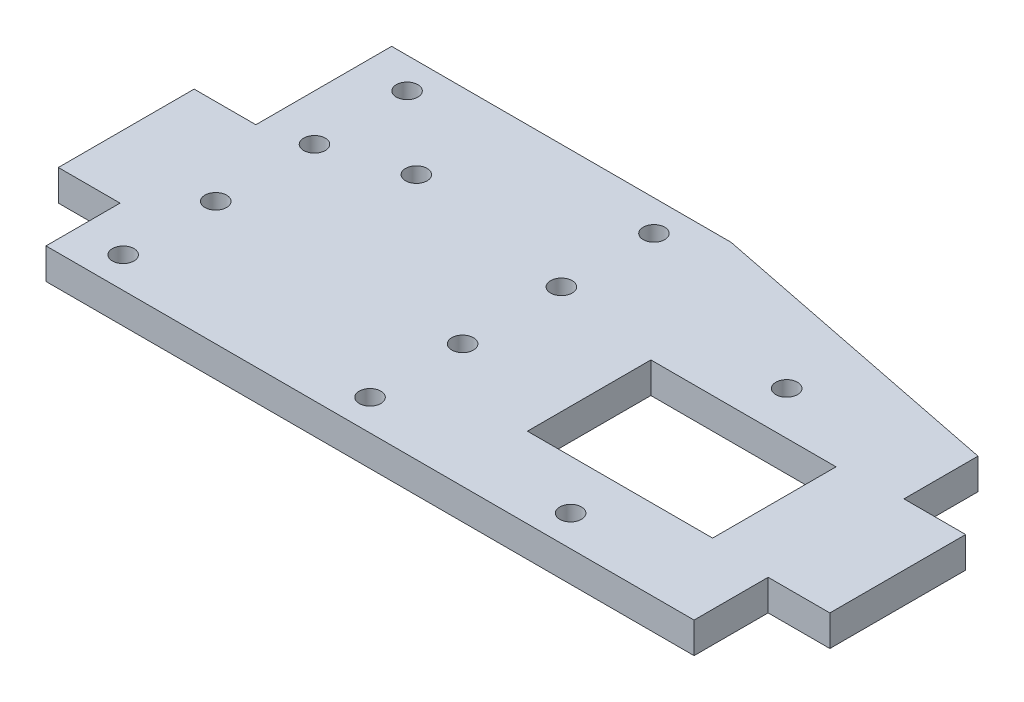
ISO-10303-21;
HEADER;
FILE_DESCRIPTION(('STEP AP214'),'2;1');
FILE_NAME('part.step','',(''),(''),'','','');
FILE_SCHEMA(('AUTOMOTIVE_DESIGN { 1 0 10303 214 1 1 1 1 }'));
ENDSEC;
DATA;
#1=APPLICATION_CONTEXT('core data for automotive mechanical design processes');
#2=APPLICATION_PROTOCOL_DEFINITION('international standard','automotive_design',2000,#1);
#3=PRODUCT_CONTEXT('',#1,'mechanical');
#4=PRODUCT('Part','Part','',(#3));
#5=PRODUCT_RELATED_PRODUCT_CATEGORY('part','',(#4));
#6=PRODUCT_DEFINITION_FORMATION('','',#4);
#7=PRODUCT_DEFINITION_CONTEXT('part definition',#1,'design');
#8=PRODUCT_DEFINITION('design','',#6,#7);
#9=PRODUCT_DEFINITION_SHAPE('','',#8);
#10=(LENGTH_UNIT() NAMED_UNIT(*) SI_UNIT(.MILLI.,.METRE.));
#11=(NAMED_UNIT(*) PLANE_ANGLE_UNIT() SI_UNIT($,.RADIAN.));
#12=(NAMED_UNIT(*) SI_UNIT($,.STERADIAN.) SOLID_ANGLE_UNIT());
#13=UNCERTAINTY_MEASURE_WITH_UNIT(LENGTH_MEASURE(1.E-05),#10,'distance_accuracy_value','');
#14=(GEOMETRIC_REPRESENTATION_CONTEXT(3) GLOBAL_UNCERTAINTY_ASSIGNED_CONTEXT((#13)) GLOBAL_UNIT_ASSIGNED_CONTEXT((#10,
#11,#12)) REPRESENTATION_CONTEXT('',''));
#15=CARTESIAN_POINT('',(0.,0.,0.));
#16=DIRECTION('',(0.,0.,1.));
#17=DIRECTION('',(1.,0.,0.));
#18=AXIS2_PLACEMENT_3D('',#15,#16,#17);
#19=CARTESIAN_POINT('',(-27.5,5.,-28.));
#20=DIRECTION('',(1.,0.,0.));
#21=DIRECTION('',(0.,0.,-1.));
#22=AXIS2_PLACEMENT_3D('',#19,#20,#21);
#23=PLANE('',#22);
#24=DIRECTION('',(0.,1.,0.));
#25=VECTOR('',#24,1.);
#26=CARTESIAN_POINT('',(-27.5,0.,16.));
#27=LINE('',#26,#25);
#28=CARTESIAN_POINT('',(-27.5,0.,16.));
#29=VERTEX_POINT('',#28);
#30=CARTESIAN_POINT('',(-27.5,5.,16.));
#31=VERTEX_POINT('',#30);
#32=EDGE_CURVE('E309',#29,#31,#27,.T.);
#33=ORIENTED_EDGE('',*,*,#32,.F.);
#34=DIRECTION('',(0.,0.,1.));
#35=VECTOR('',#34,1.);
#36=CARTESIAN_POINT('',(-27.5,0.,-28.));
#37=LINE('',#36,#35);
#38=CARTESIAN_POINT('',(-27.5,0.,28.));
#39=VERTEX_POINT('',#38);
#40=EDGE_CURVE('E80',#29,#39,#37,.T.);
#41=ORIENTED_EDGE('',*,*,#40,.T.);
#42=DIRECTION('',(0.,-1.,0.));
#43=VECTOR('',#42,1.);
#44=CARTESIAN_POINT('',(-27.5,5.,28.));
#45=LINE('',#44,#43);
#46=CARTESIAN_POINT('',(-27.5,5.,28.));
#47=VERTEX_POINT('',#46);
#48=EDGE_CURVE('E196',#47,#39,#45,.T.);
#49=ORIENTED_EDGE('',*,*,#48,.F.);
#50=DIRECTION('',(0.,0.,1.));
#51=VECTOR('',#50,1.);
#52=CARTESIAN_POINT('',(-27.5,5.,-28.));
#53=LINE('',#52,#51);
#54=EDGE_CURVE('E62',#31,#47,#53,.T.);
#55=ORIENTED_EDGE('',*,*,#54,.F.);
#56=EDGE_LOOP('',(#33,#41,#49,#55));
#57=FACE_BOUND('',#56,.T.);
#58=ADVANCED_FACE('F38',(#57),#23,.F.);
#59=CARTESIAN_POINT('',(0.,5.,0.));
#60=DIRECTION('',(0.,1.,0.));
#61=DIRECTION('',(0.,0.,1.));
#62=AXIS2_PLACEMENT_3D('',#59,#60,#61);
#63=PLANE('',#62);
#64=CARTESIAN_POINT('',(-7.5,5.,-12.));
#65=DIRECTION('',(0.,1.,0.));
#66=DIRECTION('',(0.,0.,1.));
#67=AXIS2_PLACEMENT_3D('',#64,#65,#66);
#68=CIRCLE('',#67,1.75);
#69=CARTESIAN_POINT('',(-7.5,5.,-10.25));
#70=VERTEX_POINT('',#69);
#71=EDGE_CURVE('E354',#70,#70,#68,.T.);
#72=ORIENTED_EDGE('',*,*,#71,.F.);
#73=EDGE_LOOP('',(#72));
#74=FACE_BOUND('',#73,.T.);
#75=CARTESIAN_POINT('',(52.5,5.,-12.));
#76=DIRECTION('',(0.,1.,0.));
#77=DIRECTION('',(0.,0.,1.));
#78=AXIS2_PLACEMENT_3D('',#75,#76,#77);
#79=CIRCLE('',#78,1.75);
#80=CARTESIAN_POINT('',(52.5,5.,-10.25));
#81=VERTEX_POINT('',#80);
#82=EDGE_CURVE('E348',#81,#81,#79,.T.);
#83=ORIENTED_EDGE('',*,*,#82,.F.);
#84=EDGE_LOOP('',(#83));
#85=FACE_BOUND('',#84,.T.);
#86=CARTESIAN_POINT('',(52.5,5.,23.));
#87=DIRECTION('',(0.,1.,0.));
#88=DIRECTION('',(0.,0.,1.));
#89=AXIS2_PLACEMENT_3D('',#86,#87,#88);
#90=CIRCLE('',#89,1.75);
#91=CARTESIAN_POINT('',(52.5,5.,24.75));
#92=VERTEX_POINT('',#91);
#93=EDGE_CURVE('E342',#92,#92,#90,.T.);
#94=ORIENTED_EDGE('',*,*,#93,.F.);
#95=EDGE_LOOP('',(#94));
#96=FACE_BOUND('',#95,.T.);
#97=CARTESIAN_POINT('',(-20.,5.,8.));
#98=DIRECTION('',(0.,1.,0.));
#99=DIRECTION('',(0.,0.,-1.));
#100=AXIS2_PLACEMENT_3D('',#97,#98,#99);
#101=CIRCLE('',#100,1.75);
#102=CARTESIAN_POINT('',(-20.,5.,6.25));
#103=VERTEX_POINT('',#102);
#104=EDGE_CURVE('E241',#103,#103,#101,.T.);
#105=ORIENTED_EDGE('',*,*,#104,.F.);
#106=EDGE_LOOP('',(#105));
#107=FACE_BOUND('',#106,.T.);
#108=CARTESIAN_POINT('',(20.,5.,8.));
#109=DIRECTION('',(0.,1.,0.));
#110=DIRECTION('',(0.,0.,1.));
#111=AXIS2_PLACEMENT_3D('',#108,#109,#110);
#112=CIRCLE('',#111,1.75);
#113=CARTESIAN_POINT('',(20.,5.,9.75));
#114=VERTEX_POINT('',#113);
#115=EDGE_CURVE('E229',#114,#114,#112,.T.);
#116=ORIENTED_EDGE('',*,*,#115,.F.);
#117=EDGE_LOOP('',(#116));
#118=FACE_BOUND('',#117,.T.);
#119=CARTESIAN_POINT('',(20.,5.,-8.));
#120=DIRECTION('',(0.,1.,0.));
#121=DIRECTION('',(0.,0.,-1.));
#122=AXIS2_PLACEMENT_3D('',#119,#120,#121);
#123=CIRCLE('',#122,1.75);
#124=CARTESIAN_POINT('',(20.,5.,-9.75));
#125=VERTEX_POINT('',#124);
#126=EDGE_CURVE('E217',#125,#125,#123,.T.);
#127=ORIENTED_EDGE('',*,*,#126,.F.);
#128=EDGE_LOOP('',(#127));
#129=FACE_BOUND('',#128,.T.);
#130=CARTESIAN_POINT('',(-20.,5.,-8.));
#131=DIRECTION('',(0.,1.,0.));
#132=DIRECTION('',(0.,0.,1.));
#133=AXIS2_PLACEMENT_3D('',#130,#131,#132);
#134=CIRCLE('',#133,1.75);
#135=CARTESIAN_POINT('',(-20.,5.,-6.25));
#136=VERTEX_POINT('',#135);
#137=EDGE_CURVE('E210',#136,#136,#134,.T.);
#138=ORIENTED_EDGE('',*,*,#137,.F.);
#139=EDGE_LOOP('',(#138));
#140=FACE_BOUND('',#139,.T.);
#141=DIRECTION('',(1.,0.,0.));
#142=VECTOR('',#141,1.);
#143=CARTESIAN_POINT('',(-27.5,5.,28.));
#144=LINE('',#143,#142);
#145=CARTESIAN_POINT('',(77.5,5.,28.));
#146=VERTEX_POINT('',#145);
#147=EDGE_CURVE('E197',#47,#146,#144,.T.);
#148=ORIENTED_EDGE('',*,*,#147,.T.);
#149=DIRECTION('',(0.,0.,-1.));
#150=VECTOR('',#149,1.);
#151=CARTESIAN_POINT('',(77.5,5.,28.));
#152=LINE('',#151,#150);
#153=CARTESIAN_POINT('',(77.5,5.,16.));
#154=VERTEX_POINT('',#153);
#155=EDGE_CURVE('E284',#146,#154,#152,.T.);
#156=ORIENTED_EDGE('',*,*,#155,.T.);
#157=DIRECTION('',(1.,0.,0.));
#158=VECTOR('',#157,1.);
#159=CARTESIAN_POINT('',(77.5,5.,16.));
#160=LINE('',#159,#158);
#161=CARTESIAN_POINT('',(87.5,5.,16.));
#162=VERTEX_POINT('',#161);
#163=EDGE_CURVE('E281',#154,#162,#160,.T.);
#164=ORIENTED_EDGE('',*,*,#163,.T.);
#165=DIRECTION('',(0.,0.,-1.));
#166=VECTOR('',#165,1.);
#167=CARTESIAN_POINT('',(87.5,5.,16.));
#168=LINE('',#167,#166);
#169=CARTESIAN_POINT('',(87.5,5.,-6.));
#170=VERTEX_POINT('',#169);
#171=EDGE_CURVE('E278',#162,#170,#168,.T.);
#172=ORIENTED_EDGE('',*,*,#171,.T.);
#173=DIRECTION('',(-1.,0.,0.));
#174=VECTOR('',#173,1.);
#175=CARTESIAN_POINT('',(87.5,5.,-6.));
#176=LINE('',#175,#174);
#177=CARTESIAN_POINT('',(77.5,5.,-6.));
#178=VERTEX_POINT('',#177);
#179=EDGE_CURVE('E275',#170,#178,#176,.T.);
#180=ORIENTED_EDGE('',*,*,#179,.T.);
#181=DIRECTION('',(0.,0.,-1.));
#182=VECTOR('',#181,1.);
#183=CARTESIAN_POINT('',(77.5,5.,-6.));
#184=LINE('',#183,#182);
#185=CARTESIAN_POINT('',(77.5,5.,-18.));
#186=VERTEX_POINT('',#185);
#187=EDGE_CURVE('E264',#178,#186,#184,.T.);
#188=ORIENTED_EDGE('',*,*,#187,.T.);
#189=DIRECTION('',(-0.98058067569092,0.,-0.196116135138184));
#190=VECTOR('',#189,1.);
#191=CARTESIAN_POINT('',(77.5,5.,-18.));
#192=LINE('',#191,#190);
#193=CARTESIAN_POINT('',(27.5,5.,-28.));
#194=VERTEX_POINT('',#193);
#195=EDGE_CURVE('E286',#186,#194,#192,.T.);
#196=ORIENTED_EDGE('',*,*,#195,.T.);
#197=DIRECTION('',(-1.,0.,0.));
#198=VECTOR('',#197,1.);
#199=CARTESIAN_POINT('',(-27.5,5.,-28.));
#200=LINE('',#199,#198);
#201=CARTESIAN_POINT('',(-27.5,5.,-28.));
#202=VERTEX_POINT('',#201);
#203=EDGE_CURVE('E85',#194,#202,#200,.T.);
#204=ORIENTED_EDGE('',*,*,#203,.T.);
#205=CARTESIAN_POINT('',(-27.5,5.,-6.));
#206=VERTEX_POINT('',#205);
#207=EDGE_CURVE('E201',#202,#206,#53,.T.);
#208=ORIENTED_EDGE('',*,*,#207,.T.);
#209=DIRECTION('',(-1.,0.,0.));
#210=VECTOR('',#209,1.);
#211=CARTESIAN_POINT('',(-27.5,5.,-6.));
#212=LINE('',#211,#210);
#213=CARTESIAN_POINT('',(-37.5,5.,-6.));
#214=VERTEX_POINT('',#213);
#215=EDGE_CURVE('E53',#206,#214,#212,.T.);
#216=ORIENTED_EDGE('',*,*,#215,.T.);
#217=DIRECTION('',(0.,0.,1.));
#218=VECTOR('',#217,1.);
#219=CARTESIAN_POINT('',(-37.5,5.,-6.));
#220=LINE('',#219,#218);
#221=CARTESIAN_POINT('',(-37.5,5.,16.));
#222=VERTEX_POINT('',#221);
#223=EDGE_CURVE('E335',#214,#222,#220,.T.);
#224=ORIENTED_EDGE('',*,*,#223,.T.);
#225=DIRECTION('',(1.,0.,0.));
#226=VECTOR('',#225,1.);
#227=CARTESIAN_POINT('',(-27.5,5.,16.));
#228=LINE('',#227,#226);
#229=EDGE_CURVE('E185',#222,#31,#228,.T.);
#230=ORIENTED_EDGE('',*,*,#229,.T.);
#231=ORIENTED_EDGE('',*,*,#54,.T.);
#232=EDGE_LOOP('',(#148,#156,#164,#172,#180,#188,#196,#204,#208,#216,#224,#230,#231));
#233=FACE_BOUND('',#232,.T.);
#234=CARTESIAN_POINT('',(-20.,5.,-23.));
#235=DIRECTION('',(0.,1.,0.));
#236=DIRECTION('',(0.,0.,1.));
#237=AXIS2_PLACEMENT_3D('',#234,#235,#236);
#238=CIRCLE('',#237,1.75);
#239=CARTESIAN_POINT('',(-20.,5.,-21.25));
#240=VERTEX_POINT('',#239);
#241=EDGE_CURVE('E211',#240,#240,#238,.T.);
#242=ORIENTED_EDGE('',*,*,#241,.F.);
#243=EDGE_LOOP('',(#242));
#244=FACE_BOUND('',#243,.T.);
#245=CARTESIAN_POINT('',(20.,5.,-23.));
#246=DIRECTION('',(0.,1.,0.));
#247=DIRECTION('',(0.,0.,-1.));
#248=AXIS2_PLACEMENT_3D('',#245,#246,#247);
#249=CIRCLE('',#248,1.75);
#250=CARTESIAN_POINT('',(20.,5.,-24.75));
#251=VERTEX_POINT('',#250);
#252=EDGE_CURVE('E223',#251,#251,#249,.T.);
#253=ORIENTED_EDGE('',*,*,#252,.F.);
#254=EDGE_LOOP('',(#253));
#255=FACE_BOUND('',#254,.T.);
#256=CARTESIAN_POINT('',(20.,5.,23.));
#257=DIRECTION('',(0.,1.,0.));
#258=DIRECTION('',(0.,0.,1.));
#259=AXIS2_PLACEMENT_3D('',#256,#257,#258);
#260=CIRCLE('',#259,1.75);
#261=CARTESIAN_POINT('',(20.,5.,24.75));
#262=VERTEX_POINT('',#261);
#263=EDGE_CURVE('E235',#262,#262,#260,.T.);
#264=ORIENTED_EDGE('',*,*,#263,.F.);
#265=EDGE_LOOP('',(#264));
#266=FACE_BOUND('',#265,.T.);
#267=CARTESIAN_POINT('',(-20.,5.,23.));
#268=DIRECTION('',(0.,1.,0.));
#269=DIRECTION('',(0.,0.,-1.));
#270=AXIS2_PLACEMENT_3D('',#267,#268,#269);
#271=CIRCLE('',#270,1.75);
#272=CARTESIAN_POINT('',(-20.,5.,21.25));
#273=VERTEX_POINT('',#272);
#274=EDGE_CURVE('E247',#273,#273,#271,.T.);
#275=ORIENTED_EDGE('',*,*,#274,.F.);
#276=EDGE_LOOP('',(#275));
#277=FACE_BOUND('',#276,.T.);
#278=DIRECTION('',(0.,0.,-1.));
#279=VECTOR('',#278,1.);
#280=CARTESIAN_POINT('',(67.5,5.,-4.99999999999999));
#281=LINE('',#280,#279);
#282=CARTESIAN_POINT('',(67.5,5.,15.));
#283=VERTEX_POINT('',#282);
#284=CARTESIAN_POINT('',(67.5,5.,-4.99999999999999));
#285=VERTEX_POINT('',#284);
#286=EDGE_CURVE('E306',#283,#285,#281,.T.);
#287=ORIENTED_EDGE('',*,*,#286,.F.);
#288=DIRECTION('',(1.,0.,0.));
#289=VECTOR('',#288,1.);
#290=CARTESIAN_POINT('',(37.5,5.,15.));
#291=LINE('',#290,#289);
#292=CARTESIAN_POINT('',(37.5,5.,15.));
#293=VERTEX_POINT('',#292);
#294=EDGE_CURVE('E293',#293,#283,#291,.T.);
#295=ORIENTED_EDGE('',*,*,#294,.F.);
#296=DIRECTION('',(0.,0.,1.));
#297=VECTOR('',#296,1.);
#298=CARTESIAN_POINT('',(37.5,5.,-4.99999999999999));
#299=LINE('',#298,#297);
#300=CARTESIAN_POINT('',(37.5,5.,-4.99999999999999));
#301=VERTEX_POINT('',#300);
#302=EDGE_CURVE('E300',#301,#293,#299,.T.);
#303=ORIENTED_EDGE('',*,*,#302,.F.);
#304=DIRECTION('',(-1.,0.,0.));
#305=VECTOR('',#304,1.);
#306=CARTESIAN_POINT('',(37.5,5.,-4.99999999999999));
#307=LINE('',#306,#305);
#308=EDGE_CURVE('E303',#285,#301,#307,.T.);
#309=ORIENTED_EDGE('',*,*,#308,.F.);
#310=EDGE_LOOP('',(#287,#295,#303,#309));
#311=FACE_BOUND('',#310,.T.);
#312=ADVANCED_FACE('F369',(#74,#85,#96,#107,#118,#129,#140,#233,#244,#255,#266,#277,#311),#63,.T.);
#313=CARTESIAN_POINT('',(0.,0.,0.));
#314=DIRECTION('',(0.,1.,0.));
#315=DIRECTION('',(0.,0.,1.));
#316=AXIS2_PLACEMENT_3D('',#313,#314,#315);
#317=PLANE('',#316);
#318=CARTESIAN_POINT('',(-7.5,0.,-12.));
#319=DIRECTION('',(0.,1.,0.));
#320=DIRECTION('',(0.,0.,1.));
#321=AXIS2_PLACEMENT_3D('',#318,#319,#320);
#322=CIRCLE('',#321,1.75);
#323=CARTESIAN_POINT('',(-7.5,0.,-10.25));
#324=VERTEX_POINT('',#323);
#325=EDGE_CURVE('E339',#324,#324,#322,.T.);
#326=ORIENTED_EDGE('',*,*,#325,.T.);
#327=EDGE_LOOP('',(#326));
#328=FACE_BOUND('',#327,.T.);
#329=CARTESIAN_POINT('',(52.5,0.,-12.));
#330=DIRECTION('',(0.,1.,0.));
#331=DIRECTION('',(0.,0.,1.));
#332=AXIS2_PLACEMENT_3D('',#329,#330,#331);
#333=CIRCLE('',#332,1.75);
#334=CARTESIAN_POINT('',(52.5,0.,-10.25));
#335=VERTEX_POINT('',#334);
#336=EDGE_CURVE('E351',#335,#335,#333,.T.);
#337=ORIENTED_EDGE('',*,*,#336,.T.);
#338=EDGE_LOOP('',(#337));
#339=FACE_BOUND('',#338,.T.);
#340=CARTESIAN_POINT('',(52.5,0.,23.));
#341=DIRECTION('',(0.,1.,0.));
#342=DIRECTION('',(0.,0.,1.));
#343=AXIS2_PLACEMENT_3D('',#340,#341,#342);
#344=CIRCLE('',#343,1.75);
#345=CARTESIAN_POINT('',(52.5,0.,24.75));
#346=VERTEX_POINT('',#345);
#347=EDGE_CURVE('E345',#346,#346,#344,.T.);
#348=ORIENTED_EDGE('',*,*,#347,.T.);
#349=EDGE_LOOP('',(#348));
#350=FACE_BOUND('',#349,.T.);
#351=DIRECTION('',(-1.,0.,0.));
#352=VECTOR('',#351,1.);
#353=CARTESIAN_POINT('',(-27.5,0.,-28.));
#354=LINE('',#353,#352);
#355=CARTESIAN_POINT('',(27.5,0.,-28.));
#356=VERTEX_POINT('',#355);
#357=CARTESIAN_POINT('',(-27.5,0.,-28.));
#358=VERTEX_POINT('',#357);
#359=EDGE_CURVE('E192',#356,#358,#354,.T.);
#360=ORIENTED_EDGE('',*,*,#359,.F.);
#361=DIRECTION('',(0.98058067569092,0.,0.196116135138184));
#362=VECTOR('',#361,1.);
#363=CARTESIAN_POINT('',(77.5,0.,-18.));
#364=LINE('',#363,#362);
#365=CARTESIAN_POINT('',(77.5,0.,-18.));
#366=VERTEX_POINT('',#365);
#367=EDGE_CURVE('E310',#356,#366,#364,.T.);
#368=ORIENTED_EDGE('',*,*,#367,.T.);
#369=DIRECTION('',(0.,0.,1.));
#370=VECTOR('',#369,1.);
#371=CARTESIAN_POINT('',(77.5,0.,-6.));
#372=LINE('',#371,#370);
#373=CARTESIAN_POINT('',(77.5,0.,-6.));
#374=VERTEX_POINT('',#373);
#375=EDGE_CURVE('E313',#366,#374,#372,.T.);
#376=ORIENTED_EDGE('',*,*,#375,.T.);
#377=DIRECTION('',(1.,0.,0.));
#378=VECTOR('',#377,1.);
#379=CARTESIAN_POINT('',(87.5,0.,-6.));
#380=LINE('',#379,#378);
#381=CARTESIAN_POINT('',(87.5,0.,-6.));
#382=VERTEX_POINT('',#381);
#383=EDGE_CURVE('E315',#374,#382,#380,.T.);
#384=ORIENTED_EDGE('',*,*,#383,.T.);
#385=DIRECTION('',(0.,0.,1.));
#386=VECTOR('',#385,1.);
#387=CARTESIAN_POINT('',(87.5,0.,16.));
#388=LINE('',#387,#386);
#389=CARTESIAN_POINT('',(87.5,0.,16.));
#390=VERTEX_POINT('',#389);
#391=EDGE_CURVE('E317',#382,#390,#388,.T.);
#392=ORIENTED_EDGE('',*,*,#391,.T.);
#393=DIRECTION('',(-1.,0.,0.));
#394=VECTOR('',#393,1.);
#395=CARTESIAN_POINT('',(77.5,0.,16.));
#396=LINE('',#395,#394);
#397=CARTESIAN_POINT('',(77.5,0.,16.));
#398=VERTEX_POINT('',#397);
#399=EDGE_CURVE('E319',#390,#398,#396,.T.);
#400=ORIENTED_EDGE('',*,*,#399,.T.);
#401=DIRECTION('',(0.,0.,1.));
#402=VECTOR('',#401,1.);
#403=CARTESIAN_POINT('',(77.5,0.,28.));
#404=LINE('',#403,#402);
#405=CARTESIAN_POINT('',(77.5,0.,28.));
#406=VERTEX_POINT('',#405);
#407=EDGE_CURVE('E259',#398,#406,#404,.T.);
#408=ORIENTED_EDGE('',*,*,#407,.T.);
#409=DIRECTION('',(1.,0.,0.));
#410=VECTOR('',#409,1.);
#411=CARTESIAN_POINT('',(-27.5,0.,28.));
#412=LINE('',#411,#410);
#413=EDGE_CURVE('E189',#39,#406,#412,.T.);
#414=ORIENTED_EDGE('',*,*,#413,.F.);
#415=ORIENTED_EDGE('',*,*,#40,.F.);
#416=DIRECTION('',(1.,0.,0.));
#417=VECTOR('',#416,1.);
#418=CARTESIAN_POINT('',(-27.5,0.,16.));
#419=LINE('',#418,#417);
#420=CARTESIAN_POINT('',(-37.5,0.,16.));
#421=VERTEX_POINT('',#420);
#422=EDGE_CURVE('E174',#421,#29,#419,.T.);
#423=ORIENTED_EDGE('',*,*,#422,.F.);
#424=DIRECTION('',(0.,0.,1.));
#425=VECTOR('',#424,1.);
#426=CARTESIAN_POINT('',(-37.5,0.,-6.));
#427=LINE('',#426,#425);
#428=CARTESIAN_POINT('',(-37.5,0.,-6.));
#429=VERTEX_POINT('',#428);
#430=EDGE_CURVE('E184',#429,#421,#427,.T.);
#431=ORIENTED_EDGE('',*,*,#430,.F.);
#432=DIRECTION('',(-1.,0.,0.));
#433=VECTOR('',#432,1.);
#434=CARTESIAN_POINT('',(-27.5,0.,-6.));
#435=LINE('',#434,#433);
#436=CARTESIAN_POINT('',(-27.5,0.,-6.));
#437=VERTEX_POINT('',#436);
#438=EDGE_CURVE('E168',#437,#429,#435,.T.);
#439=ORIENTED_EDGE('',*,*,#438,.F.);
#440=EDGE_CURVE('E181',#358,#437,#37,.T.);
#441=ORIENTED_EDGE('',*,*,#440,.F.);
#442=EDGE_LOOP('',(#360,#368,#376,#384,#392,#400,#408,#414,#415,#423,#431,#439,#441));
#443=FACE_BOUND('',#442,.T.);
#444=CARTESIAN_POINT('',(-20.,0.,-8.));
#445=DIRECTION('',(0.,1.,0.));
#446=DIRECTION('',(0.,0.,1.));
#447=AXIS2_PLACEMENT_3D('',#444,#445,#446);
#448=CIRCLE('',#447,1.75);
#449=CARTESIAN_POINT('',(-20.,0.,-6.25));
#450=VERTEX_POINT('',#449);
#451=EDGE_CURVE('E207',#450,#450,#448,.T.);
#452=ORIENTED_EDGE('',*,*,#451,.T.);
#453=EDGE_LOOP('',(#452));
#454=FACE_BOUND('',#453,.T.);
#455=CARTESIAN_POINT('',(-20.,0.,-23.));
#456=DIRECTION('',(0.,1.,0.));
#457=DIRECTION('',(0.,0.,1.));
#458=AXIS2_PLACEMENT_3D('',#455,#456,#457);
#459=CIRCLE('',#458,1.75);
#460=CARTESIAN_POINT('',(-20.,0.,-21.25));
#461=VERTEX_POINT('',#460);
#462=EDGE_CURVE('E214',#461,#461,#459,.T.);
#463=ORIENTED_EDGE('',*,*,#462,.T.);
#464=EDGE_LOOP('',(#463));
#465=FACE_BOUND('',#464,.T.);
#466=CARTESIAN_POINT('',(20.,0.,-8.));
#467=DIRECTION('',(0.,1.,0.));
#468=DIRECTION('',(0.,0.,-1.));
#469=AXIS2_PLACEMENT_3D('',#466,#467,#468);
#470=CIRCLE('',#469,1.75);
#471=CARTESIAN_POINT('',(20.,0.,-9.75));
#472=VERTEX_POINT('',#471);
#473=EDGE_CURVE('E220',#472,#472,#470,.T.);
#474=ORIENTED_EDGE('',*,*,#473,.T.);
#475=EDGE_LOOP('',(#474));
#476=FACE_BOUND('',#475,.T.);
#477=CARTESIAN_POINT('',(20.,0.,-23.));
#478=DIRECTION('',(0.,1.,0.));
#479=DIRECTION('',(0.,0.,-1.));
#480=AXIS2_PLACEMENT_3D('',#477,#478,#479);
#481=CIRCLE('',#480,1.75);
#482=CARTESIAN_POINT('',(20.,0.,-24.75));
#483=VERTEX_POINT('',#482);
#484=EDGE_CURVE('E226',#483,#483,#481,.T.);
#485=ORIENTED_EDGE('',*,*,#484,.T.);
#486=EDGE_LOOP('',(#485));
#487=FACE_BOUND('',#486,.T.);
#488=CARTESIAN_POINT('',(20.,0.,8.));
#489=DIRECTION('',(0.,1.,0.));
#490=DIRECTION('',(0.,0.,1.));
#491=AXIS2_PLACEMENT_3D('',#488,#489,#490);
#492=CIRCLE('',#491,1.75);
#493=CARTESIAN_POINT('',(20.,0.,9.75));
#494=VERTEX_POINT('',#493);
#495=EDGE_CURVE('E232',#494,#494,#492,.T.);
#496=ORIENTED_EDGE('',*,*,#495,.T.);
#497=EDGE_LOOP('',(#496));
#498=FACE_BOUND('',#497,.T.);
#499=CARTESIAN_POINT('',(20.,0.,23.));
#500=DIRECTION('',(0.,1.,0.));
#501=DIRECTION('',(0.,0.,1.));
#502=AXIS2_PLACEMENT_3D('',#499,#500,#501);
#503=CIRCLE('',#502,1.75);
#504=CARTESIAN_POINT('',(20.,0.,24.75));
#505=VERTEX_POINT('',#504);
#506=EDGE_CURVE('E238',#505,#505,#503,.T.);
#507=ORIENTED_EDGE('',*,*,#506,.T.);
#508=EDGE_LOOP('',(#507));
#509=FACE_BOUND('',#508,.T.);
#510=CARTESIAN_POINT('',(-20.,0.,8.));
#511=DIRECTION('',(0.,1.,0.));
#512=DIRECTION('',(0.,0.,-1.));
#513=AXIS2_PLACEMENT_3D('',#510,#511,#512);
#514=CIRCLE('',#513,1.75);
#515=CARTESIAN_POINT('',(-20.,0.,6.25));
#516=VERTEX_POINT('',#515);
#517=EDGE_CURVE('E244',#516,#516,#514,.T.);
#518=ORIENTED_EDGE('',*,*,#517,.T.);
#519=EDGE_LOOP('',(#518));
#520=FACE_BOUND('',#519,.T.);
#521=CARTESIAN_POINT('',(-20.,0.,23.));
#522=DIRECTION('',(0.,1.,0.));
#523=DIRECTION('',(0.,0.,-1.));
#524=AXIS2_PLACEMENT_3D('',#521,#522,#523);
#525=CIRCLE('',#524,1.75);
#526=CARTESIAN_POINT('',(-20.,0.,21.25));
#527=VERTEX_POINT('',#526);
#528=EDGE_CURVE('E250',#527,#527,#525,.T.);
#529=ORIENTED_EDGE('',*,*,#528,.T.);
#530=EDGE_LOOP('',(#529));
#531=FACE_BOUND('',#530,.T.);
#532=DIRECTION('',(1.,0.,0.));
#533=VECTOR('',#532,1.);
#534=CARTESIAN_POINT('',(37.5,0.,-4.99999999999999));
#535=LINE('',#534,#533);
#536=CARTESIAN_POINT('',(37.5,0.,-4.99999999999999));
#537=VERTEX_POINT('',#536);
#538=CARTESIAN_POINT('',(67.5,0.,-4.99999999999999));
#539=VERTEX_POINT('',#538);
#540=EDGE_CURVE('E256',#537,#539,#535,.T.);
#541=ORIENTED_EDGE('',*,*,#540,.F.);
#542=DIRECTION('',(0.,0.,-1.));
#543=VECTOR('',#542,1.);
#544=CARTESIAN_POINT('',(37.5,0.,-4.99999999999999));
#545=LINE('',#544,#543);
#546=CARTESIAN_POINT('',(37.5,0.,15.));
#547=VERTEX_POINT('',#546);
#548=EDGE_CURVE('E253',#547,#537,#545,.T.);
#549=ORIENTED_EDGE('',*,*,#548,.F.);
#550=DIRECTION('',(-1.,0.,0.));
#551=VECTOR('',#550,1.);
#552=CARTESIAN_POINT('',(37.5,0.,15.));
#553=LINE('',#552,#551);
#554=CARTESIAN_POINT('',(67.5,0.,15.));
#555=VERTEX_POINT('',#554);
#556=EDGE_CURVE('E325',#555,#547,#553,.T.);
#557=ORIENTED_EDGE('',*,*,#556,.F.);
#558=DIRECTION('',(0.,0.,1.));
#559=VECTOR('',#558,1.);
#560=CARTESIAN_POINT('',(67.5,0.,-4.99999999999999));
#561=LINE('',#560,#559);
#562=EDGE_CURVE('E312',#539,#555,#561,.T.);
#563=ORIENTED_EDGE('',*,*,#562,.F.);
#564=EDGE_LOOP('',(#541,#549,#557,#563));
#565=FACE_BOUND('',#564,.T.);
#566=ADVANCED_FACE('F179',(#328,#339,#350,#443,#454,#465,#476,#487,#498,#509,#520,#531,#565),
#317,.F.);
#567=CARTESIAN_POINT('',(-27.5,5.,-28.));
#568=DIRECTION('',(0.,0.,1.));
#569=DIRECTION('',(1.,0.,0.));
#570=AXIS2_PLACEMENT_3D('',#567,#568,#569);
#571=PLANE('',#570);
#572=ORIENTED_EDGE('',*,*,#359,.T.);
#573=DIRECTION('',(0.,-1.,0.));
#574=VECTOR('',#573,1.);
#575=CARTESIAN_POINT('',(-27.5,5.,-28.));
#576=LINE('',#575,#574);
#577=EDGE_CURVE('E46',#202,#358,#576,.T.);
#578=ORIENTED_EDGE('',*,*,#577,.F.);
#579=ORIENTED_EDGE('',*,*,#203,.F.);
#580=DIRECTION('',(0.,-1.,0.));
#581=VECTOR('',#580,1.);
#582=CARTESIAN_POINT('',(27.5,5.,-28.));
#583=LINE('',#582,#581);
#584=EDGE_CURVE('E11',#194,#356,#583,.T.);
#585=ORIENTED_EDGE('',*,*,#584,.T.);
#586=EDGE_LOOP('',(#572,#578,#579,#585));
#587=FACE_BOUND('',#586,.T.);
#588=ADVANCED_FACE('F40',(#587),#571,.F.);
#589=ORIENTED_EDGE('',*,*,#440,.T.);
#590=DIRECTION('',(0.,1.,0.));
#591=VECTOR('',#590,1.);
#592=CARTESIAN_POINT('',(-27.5,0.,-6.));
#593=LINE('',#592,#591);
#594=EDGE_CURVE('E165',#437,#206,#593,.T.);
#595=ORIENTED_EDGE('',*,*,#594,.T.);
#596=ORIENTED_EDGE('',*,*,#207,.F.);
#597=ORIENTED_EDGE('',*,*,#577,.T.);
#598=EDGE_LOOP('',(#589,#595,#596,#597));
#599=FACE_BOUND('',#598,.T.);
#600=ADVANCED_FACE('F188',(#599),#23,.F.);
#601=CARTESIAN_POINT('',(-27.5,5.,28.));
#602=DIRECTION('',(0.,0.,-1.));
#603=DIRECTION('',(-1.,0.,0.));
#604=AXIS2_PLACEMENT_3D('',#601,#602,#603);
#605=PLANE('',#604);
#606=ORIENTED_EDGE('',*,*,#413,.T.);
#607=DIRECTION('',(0.,1.,0.));
#608=VECTOR('',#607,1.);
#609=CARTESIAN_POINT('',(77.5,-82.0731381147328,28.));
#610=LINE('',#609,#608);
#611=EDGE_CURVE('E261',#406,#146,#610,.T.);
#612=ORIENTED_EDGE('',*,*,#611,.T.);
#613=ORIENTED_EDGE('',*,*,#147,.F.);
#614=ORIENTED_EDGE('',*,*,#48,.T.);
#615=EDGE_LOOP('',(#606,#612,#613,#614));
#616=FACE_BOUND('',#615,.T.);
#617=ADVANCED_FACE('F420',(#616),#605,.F.);
#618=CARTESIAN_POINT('',(-20.,5.,-8.));
#619=DIRECTION('',(0.,-1.,0.));
#620=DIRECTION('',(0.,0.,-1.));
#621=AXIS2_PLACEMENT_3D('',#618,#619,#620);
#622=CYLINDRICAL_SURFACE('',#621,1.75);
#623=ORIENTED_EDGE('',*,*,#137,.T.);
#624=EDGE_LOOP('',(#623));
#625=FACE_BOUND('',#624,.T.);
#626=ORIENTED_EDGE('',*,*,#451,.F.);
#627=EDGE_LOOP('',(#626));
#628=FACE_BOUND('',#627,.T.);
#629=ADVANCED_FACE('F424',(#625,#628),#622,.F.);
#630=CARTESIAN_POINT('',(-20.,5.,-23.));
#631=DIRECTION('',(0.,-1.,0.));
#632=DIRECTION('',(0.,0.,-1.));
#633=AXIS2_PLACEMENT_3D('',#630,#631,#632);
#634=CYLINDRICAL_SURFACE('',#633,1.75);
#635=ORIENTED_EDGE('',*,*,#241,.T.);
#636=EDGE_LOOP('',(#635));
#637=FACE_BOUND('',#636,.T.);
#638=ORIENTED_EDGE('',*,*,#462,.F.);
#639=EDGE_LOOP('',(#638));
#640=FACE_BOUND('',#639,.T.);
#641=ADVANCED_FACE('F428',(#637,#640),#634,.F.);
#642=CARTESIAN_POINT('',(20.,5.,-8.));
#643=DIRECTION('',(0.,-1.,0.));
#644=DIRECTION('',(0.,0.,-1.));
#645=AXIS2_PLACEMENT_3D('',#642,#643,#644);
#646=CYLINDRICAL_SURFACE('',#645,1.75);
#647=ORIENTED_EDGE('',*,*,#126,.T.);
#648=EDGE_LOOP('',(#647));
#649=FACE_BOUND('',#648,.T.);
#650=ORIENTED_EDGE('',*,*,#473,.F.);
#651=EDGE_LOOP('',(#650));
#652=FACE_BOUND('',#651,.T.);
#653=ADVANCED_FACE('F517',(#649,#652),#646,.F.);
#654=CARTESIAN_POINT('',(20.,5.,-23.));
#655=DIRECTION('',(0.,-1.,0.));
#656=DIRECTION('',(0.,0.,-1.));
#657=AXIS2_PLACEMENT_3D('',#654,#655,#656);
#658=CYLINDRICAL_SURFACE('',#657,1.75);
#659=ORIENTED_EDGE('',*,*,#252,.T.);
#660=EDGE_LOOP('',(#659));
#661=FACE_BOUND('',#660,.T.);
#662=ORIENTED_EDGE('',*,*,#484,.F.);
#663=EDGE_LOOP('',(#662));
#664=FACE_BOUND('',#663,.T.);
#665=ADVANCED_FACE('F513',(#661,#664),#658,.F.);
#666=CARTESIAN_POINT('',(20.,5.,8.));
#667=DIRECTION('',(0.,-1.,0.));
#668=DIRECTION('',(0.,0.,-1.));
#669=AXIS2_PLACEMENT_3D('',#666,#667,#668);
#670=CYLINDRICAL_SURFACE('',#669,1.75);
#671=ORIENTED_EDGE('',*,*,#115,.T.);
#672=EDGE_LOOP('',(#671));
#673=FACE_BOUND('',#672,.T.);
#674=ORIENTED_EDGE('',*,*,#495,.F.);
#675=EDGE_LOOP('',(#674));
#676=FACE_BOUND('',#675,.T.);
#677=ADVANCED_FACE('F509',(#673,#676),#670,.F.);
#678=CARTESIAN_POINT('',(20.,5.,23.));
#679=DIRECTION('',(0.,-1.,0.));
#680=DIRECTION('',(0.,0.,-1.));
#681=AXIS2_PLACEMENT_3D('',#678,#679,#680);
#682=CYLINDRICAL_SURFACE('',#681,1.75);
#683=ORIENTED_EDGE('',*,*,#263,.T.);
#684=EDGE_LOOP('',(#683));
#685=FACE_BOUND('',#684,.T.);
#686=ORIENTED_EDGE('',*,*,#506,.F.);
#687=EDGE_LOOP('',(#686));
#688=FACE_BOUND('',#687,.T.);
#689=ADVANCED_FACE('F505',(#685,#688),#682,.F.);
#690=CARTESIAN_POINT('',(-20.,5.,8.));
#691=DIRECTION('',(0.,-1.,0.));
#692=DIRECTION('',(0.,0.,-1.));
#693=AXIS2_PLACEMENT_3D('',#690,#691,#692);
#694=CYLINDRICAL_SURFACE('',#693,1.75);
#695=ORIENTED_EDGE('',*,*,#104,.T.);
#696=EDGE_LOOP('',(#695));
#697=FACE_BOUND('',#696,.T.);
#698=ORIENTED_EDGE('',*,*,#517,.F.);
#699=EDGE_LOOP('',(#698));
#700=FACE_BOUND('',#699,.T.);
#701=ADVANCED_FACE('F501',(#697,#700),#694,.F.);
#702=CARTESIAN_POINT('',(-20.,5.,23.));
#703=DIRECTION('',(0.,-1.,0.));
#704=DIRECTION('',(0.,0.,-1.));
#705=AXIS2_PLACEMENT_3D('',#702,#703,#704);
#706=CYLINDRICAL_SURFACE('',#705,1.75);
#707=ORIENTED_EDGE('',*,*,#274,.T.);
#708=EDGE_LOOP('',(#707));
#709=FACE_BOUND('',#708,.T.);
#710=ORIENTED_EDGE('',*,*,#528,.F.);
#711=EDGE_LOOP('',(#710));
#712=FACE_BOUND('',#711,.T.);
#713=ADVANCED_FACE('F496',(#709,#712),#706,.F.);
#714=CARTESIAN_POINT('',(77.5,-82.0731381147328,28.));
#715=DIRECTION('',(1.,0.,0.));
#716=DIRECTION('',(0.,0.,-1.));
#717=AXIS2_PLACEMENT_3D('',#714,#715,#716);
#718=PLANE('',#717);
#719=ORIENTED_EDGE('',*,*,#407,.F.);
#720=DIRECTION('',(0.,1.,0.));
#721=VECTOR('',#720,1.);
#722=CARTESIAN_POINT('',(77.5,-82.0731381147328,16.));
#723=LINE('',#722,#721);
#724=EDGE_CURVE('E263',#398,#154,#723,.T.);
#725=ORIENTED_EDGE('',*,*,#724,.T.);
#726=ORIENTED_EDGE('',*,*,#155,.F.);
#727=ORIENTED_EDGE('',*,*,#611,.F.);
#728=EDGE_LOOP('',(#719,#725,#726,#727));
#729=FACE_BOUND('',#728,.T.);
#730=ADVANCED_FACE('F437',(#729),#718,.T.);
#731=CARTESIAN_POINT('',(77.5,-82.0731381147328,16.));
#732=DIRECTION('',(0.,0.,1.));
#733=DIRECTION('',(1.,0.,0.));
#734=AXIS2_PLACEMENT_3D('',#731,#732,#733);
#735=PLANE('',#734);
#736=ORIENTED_EDGE('',*,*,#399,.F.);
#737=DIRECTION('',(0.,1.,0.));
#738=VECTOR('',#737,1.);
#739=CARTESIAN_POINT('',(87.5,-82.0731381147328,16.));
#740=LINE('',#739,#738);
#741=EDGE_CURVE('E266',#390,#162,#740,.T.);
#742=ORIENTED_EDGE('',*,*,#741,.T.);
#743=ORIENTED_EDGE('',*,*,#163,.F.);
#744=ORIENTED_EDGE('',*,*,#724,.F.);
#745=EDGE_LOOP('',(#736,#742,#743,#744));
#746=FACE_BOUND('',#745,.T.);
#747=ADVANCED_FACE('F441',(#746),#735,.T.);
#748=CARTESIAN_POINT('',(87.5,-82.0731381147328,16.));
#749=DIRECTION('',(1.,0.,0.));
#750=DIRECTION('',(0.,0.,-1.));
#751=AXIS2_PLACEMENT_3D('',#748,#749,#750);
#752=PLANE('',#751);
#753=ORIENTED_EDGE('',*,*,#391,.F.);
#754=DIRECTION('',(0.,1.,0.));
#755=VECTOR('',#754,1.);
#756=CARTESIAN_POINT('',(87.5,-82.0731381147328,-6.));
#757=LINE('',#756,#755);
#758=EDGE_CURVE('E268',#382,#170,#757,.T.);
#759=ORIENTED_EDGE('',*,*,#758,.T.);
#760=ORIENTED_EDGE('',*,*,#171,.F.);
#761=ORIENTED_EDGE('',*,*,#741,.F.);
#762=EDGE_LOOP('',(#753,#759,#760,#761));
#763=FACE_BOUND('',#762,.T.);
#764=ADVANCED_FACE('F445',(#763),#752,.T.);
#765=CARTESIAN_POINT('',(87.5,-82.0731381147328,-6.));
#766=DIRECTION('',(0.,0.,-1.));
#767=DIRECTION('',(-1.,0.,0.));
#768=AXIS2_PLACEMENT_3D('',#765,#766,#767);
#769=PLANE('',#768);
#770=ORIENTED_EDGE('',*,*,#383,.F.);
#771=DIRECTION('',(0.,1.,0.));
#772=VECTOR('',#771,1.);
#773=CARTESIAN_POINT('',(77.5,-82.0731381147328,-6.));
#774=LINE('',#773,#772);
#775=EDGE_CURVE('E270',#374,#178,#774,.T.);
#776=ORIENTED_EDGE('',*,*,#775,.T.);
#777=ORIENTED_EDGE('',*,*,#179,.F.);
#778=ORIENTED_EDGE('',*,*,#758,.F.);
#779=EDGE_LOOP('',(#770,#776,#777,#778));
#780=FACE_BOUND('',#779,.T.);
#781=ADVANCED_FACE('F450',(#780),#769,.T.);
#782=CARTESIAN_POINT('',(77.5,-82.0731381147328,-6.));
#783=DIRECTION('',(1.,0.,0.));
#784=DIRECTION('',(0.,0.,-1.));
#785=AXIS2_PLACEMENT_3D('',#782,#783,#784);
#786=PLANE('',#785);
#787=ORIENTED_EDGE('',*,*,#375,.F.);
#788=DIRECTION('',(0.,1.,0.));
#789=VECTOR('',#788,1.);
#790=CARTESIAN_POINT('',(77.5,-82.0731381147328,-18.));
#791=LINE('',#790,#789);
#792=EDGE_CURVE('E260',#366,#186,#791,.T.);
#793=ORIENTED_EDGE('',*,*,#792,.T.);
#794=ORIENTED_EDGE('',*,*,#187,.F.);
#795=ORIENTED_EDGE('',*,*,#775,.F.);
#796=EDGE_LOOP('',(#787,#793,#794,#795));
#797=FACE_BOUND('',#796,.T.);
#798=ADVANCED_FACE('F455',(#797),#786,.T.);
#799=CARTESIAN_POINT('',(77.5,-82.0731381147328,-18.));
#800=DIRECTION('',(0.196116135138184,0.,-0.98058067569092));
#801=DIRECTION('',(-0.98058067569092,0.,-0.196116135138184));
#802=AXIS2_PLACEMENT_3D('',#799,#800,#801);
#803=PLANE('',#802);
#804=ORIENTED_EDGE('',*,*,#367,.F.);
#805=ORIENTED_EDGE('',*,*,#584,.F.);
#806=ORIENTED_EDGE('',*,*,#195,.F.);
#807=ORIENTED_EDGE('',*,*,#792,.F.);
#808=EDGE_LOOP('',(#804,#805,#806,#807));
#809=FACE_BOUND('',#808,.T.);
#810=ADVANCED_FACE('F460',(#809),#803,.T.);
#811=CARTESIAN_POINT('',(37.5,-82.0731381147328,-4.99999999999999));
#812=DIRECTION('',(0.,0.,-1.));
#813=DIRECTION('',(-1.,0.,0.));
#814=AXIS2_PLACEMENT_3D('',#811,#812,#813);
#815=PLANE('',#814);
#816=DIRECTION('',(0.,1.,0.));
#817=VECTOR('',#816,1.);
#818=CARTESIAN_POINT('',(37.5,-82.0731381147328,-4.99999999999999));
#819=LINE('',#818,#817);
#820=EDGE_CURVE('E292',#537,#301,#819,.T.);
#821=ORIENTED_EDGE('',*,*,#820,.F.);
#822=ORIENTED_EDGE('',*,*,#540,.T.);
#823=DIRECTION('',(0.,1.,0.));
#824=VECTOR('',#823,1.);
#825=CARTESIAN_POINT('',(67.5,-82.0731381147328,-4.99999999999999));
#826=LINE('',#825,#824);
#827=EDGE_CURVE('E290',#539,#285,#826,.T.);
#828=ORIENTED_EDGE('',*,*,#827,.T.);
#829=ORIENTED_EDGE('',*,*,#308,.T.);
#830=EDGE_LOOP('',(#821,#822,#828,#829));
#831=FACE_BOUND('',#830,.T.);
#832=ADVANCED_FACE('F408',(#831),#815,.F.);
#833=CARTESIAN_POINT('',(37.5,-82.0731381147328,-4.99999999999999));
#834=DIRECTION('',(-1.,0.,0.));
#835=DIRECTION('',(0.,0.,1.));
#836=AXIS2_PLACEMENT_3D('',#833,#834,#835);
#837=PLANE('',#836);
#838=DIRECTION('',(0.,1.,0.));
#839=VECTOR('',#838,1.);
#840=CARTESIAN_POINT('',(37.5,-82.0731381147328,15.));
#841=LINE('',#840,#839);
#842=EDGE_CURVE('E295',#547,#293,#841,.T.);
#843=ORIENTED_EDGE('',*,*,#842,.F.);
#844=ORIENTED_EDGE('',*,*,#548,.T.);
#845=ORIENTED_EDGE('',*,*,#820,.T.);
#846=ORIENTED_EDGE('',*,*,#302,.T.);
#847=EDGE_LOOP('',(#843,#844,#845,#846));
#848=FACE_BOUND('',#847,.T.);
#849=ADVANCED_FACE('F405',(#848),#837,.F.);
#850=CARTESIAN_POINT('',(37.5,-82.0731381147328,15.));
#851=DIRECTION('',(0.,0.,1.));
#852=DIRECTION('',(1.,0.,0.));
#853=AXIS2_PLACEMENT_3D('',#850,#851,#852);
#854=PLANE('',#853);
#855=DIRECTION('',(0.,1.,0.));
#856=VECTOR('',#855,1.);
#857=CARTESIAN_POINT('',(67.5,-82.0731381147328,15.));
#858=LINE('',#857,#856);
#859=EDGE_CURVE('E289',#555,#283,#858,.T.);
#860=ORIENTED_EDGE('',*,*,#859,.F.);
#861=ORIENTED_EDGE('',*,*,#556,.T.);
#862=ORIENTED_EDGE('',*,*,#842,.T.);
#863=ORIENTED_EDGE('',*,*,#294,.T.);
#864=EDGE_LOOP('',(#860,#861,#862,#863));
#865=FACE_BOUND('',#864,.T.);
#866=ADVANCED_FACE('F402',(#865),#854,.F.);
#867=CARTESIAN_POINT('',(67.5,-82.0731381147328,-4.99999999999999));
#868=DIRECTION('',(1.,0.,0.));
#869=DIRECTION('',(0.,0.,-1.));
#870=AXIS2_PLACEMENT_3D('',#867,#868,#869);
#871=PLANE('',#870);
#872=ORIENTED_EDGE('',*,*,#827,.F.);
#873=ORIENTED_EDGE('',*,*,#562,.T.);
#874=ORIENTED_EDGE('',*,*,#859,.T.);
#875=ORIENTED_EDGE('',*,*,#286,.T.);
#876=EDGE_LOOP('',(#872,#873,#874,#875));
#877=FACE_BOUND('',#876,.T.);
#878=ADVANCED_FACE('F399',(#877),#871,.F.);
#879=CARTESIAN_POINT('',(-27.5,0.,16.));
#880=DIRECTION('',(0.,0.,1.));
#881=DIRECTION('',(1.,0.,0.));
#882=AXIS2_PLACEMENT_3D('',#879,#880,#881);
#883=PLANE('',#882);
#884=ORIENTED_EDGE('',*,*,#229,.F.);
#885=DIRECTION('',(0.,1.,0.));
#886=VECTOR('',#885,1.);
#887=CARTESIAN_POINT('',(-37.5,0.,16.));
#888=LINE('',#887,#886);
#889=EDGE_CURVE('E331',#421,#222,#888,.T.);
#890=ORIENTED_EDGE('',*,*,#889,.F.);
#891=ORIENTED_EDGE('',*,*,#422,.T.);
#892=ORIENTED_EDGE('',*,*,#32,.T.);
#893=EDGE_LOOP('',(#884,#890,#891,#892));
#894=FACE_BOUND('',#893,.T.);
#895=ADVANCED_FACE('F465',(#894),#883,.T.);
#896=CARTESIAN_POINT('',(-37.5,0.,-6.));
#897=DIRECTION('',(-1.,0.,0.));
#898=DIRECTION('',(0.,0.,1.));
#899=AXIS2_PLACEMENT_3D('',#896,#897,#898);
#900=PLANE('',#899);
#901=ORIENTED_EDGE('',*,*,#223,.F.);
#902=DIRECTION('',(0.,1.,0.));
#903=VECTOR('',#902,1.);
#904=CARTESIAN_POINT('',(-37.5,0.,-6.));
#905=LINE('',#904,#903);
#906=EDGE_CURVE('E173',#429,#214,#905,.T.);
#907=ORIENTED_EDGE('',*,*,#906,.F.);
#908=ORIENTED_EDGE('',*,*,#430,.T.);
#909=ORIENTED_EDGE('',*,*,#889,.T.);
#910=EDGE_LOOP('',(#901,#907,#908,#909));
#911=FACE_BOUND('',#910,.T.);
#912=ADVANCED_FACE('F466',(#911),#900,.T.);
#913=CARTESIAN_POINT('',(-27.5,0.,-6.));
#914=DIRECTION('',(0.,0.,-1.));
#915=DIRECTION('',(-1.,0.,0.));
#916=AXIS2_PLACEMENT_3D('',#913,#914,#915);
#917=PLANE('',#916);
#918=ORIENTED_EDGE('',*,*,#215,.F.);
#919=ORIENTED_EDGE('',*,*,#594,.F.);
#920=ORIENTED_EDGE('',*,*,#438,.T.);
#921=ORIENTED_EDGE('',*,*,#906,.T.);
#922=EDGE_LOOP('',(#918,#919,#920,#921));
#923=FACE_BOUND('',#922,.T.);
#924=ADVANCED_FACE('F167',(#923),#917,.T.);
#925=CARTESIAN_POINT('',(52.5,0.,23.));
#926=DIRECTION('',(0.,1.,0.));
#927=DIRECTION('',(0.,0.,1.));
#928=AXIS2_PLACEMENT_3D('',#925,#926,#927);
#929=CYLINDRICAL_SURFACE('',#928,1.75);
#930=ORIENTED_EDGE('',*,*,#347,.F.);
#931=EDGE_LOOP('',(#930));
#932=FACE_BOUND('',#931,.T.);
#933=ORIENTED_EDGE('',*,*,#93,.T.);
#934=EDGE_LOOP('',(#933));
#935=FACE_BOUND('',#934,.T.);
#936=ADVANCED_FACE('F473',(#932,#935),#929,.F.);
#937=CARTESIAN_POINT('',(52.5,0.,-12.));
#938=DIRECTION('',(0.,1.,0.));
#939=DIRECTION('',(0.,0.,1.));
#940=AXIS2_PLACEMENT_3D('',#937,#938,#939);
#941=CYLINDRICAL_SURFACE('',#940,1.75);
#942=ORIENTED_EDGE('',*,*,#336,.F.);
#943=EDGE_LOOP('',(#942));
#944=FACE_BOUND('',#943,.T.);
#945=ORIENTED_EDGE('',*,*,#82,.T.);
#946=EDGE_LOOP('',(#945));
#947=FACE_BOUND('',#946,.T.);
#948=ADVANCED_FACE('F365',(#944,#947),#941,.F.);
#949=CARTESIAN_POINT('',(-7.5,0.,-12.));
#950=DIRECTION('',(0.,1.,0.));
#951=DIRECTION('',(0.,0.,1.));
#952=AXIS2_PLACEMENT_3D('',#949,#950,#951);
#953=CYLINDRICAL_SURFACE('',#952,1.75);
#954=ORIENTED_EDGE('',*,*,#325,.F.);
#955=EDGE_LOOP('',(#954));
#956=FACE_BOUND('',#955,.T.);
#957=ORIENTED_EDGE('',*,*,#71,.T.);
#958=EDGE_LOOP('',(#957));
#959=FACE_BOUND('',#958,.T.);
#960=ADVANCED_FACE('F362',(#956,#959),#953,.F.);
#961=CLOSED_SHELL('',(#58,#312,#566,#588,#600,#617,#629,#641,#653,#665,#677,#689,#701,#713,#730,
#747,#764,#781,#798,#810,#832,#849,#866,#878,#895,#912,#924,#936,#948,#960));
#962=MANIFOLD_SOLID_BREP('B2',#961);
#963=ADVANCED_BREP_SHAPE_REPRESENTATION('',(#18,#962),#14);
#964=SHAPE_DEFINITION_REPRESENTATION(#9,#963);
ENDSEC;
END-ISO-10303-21;
